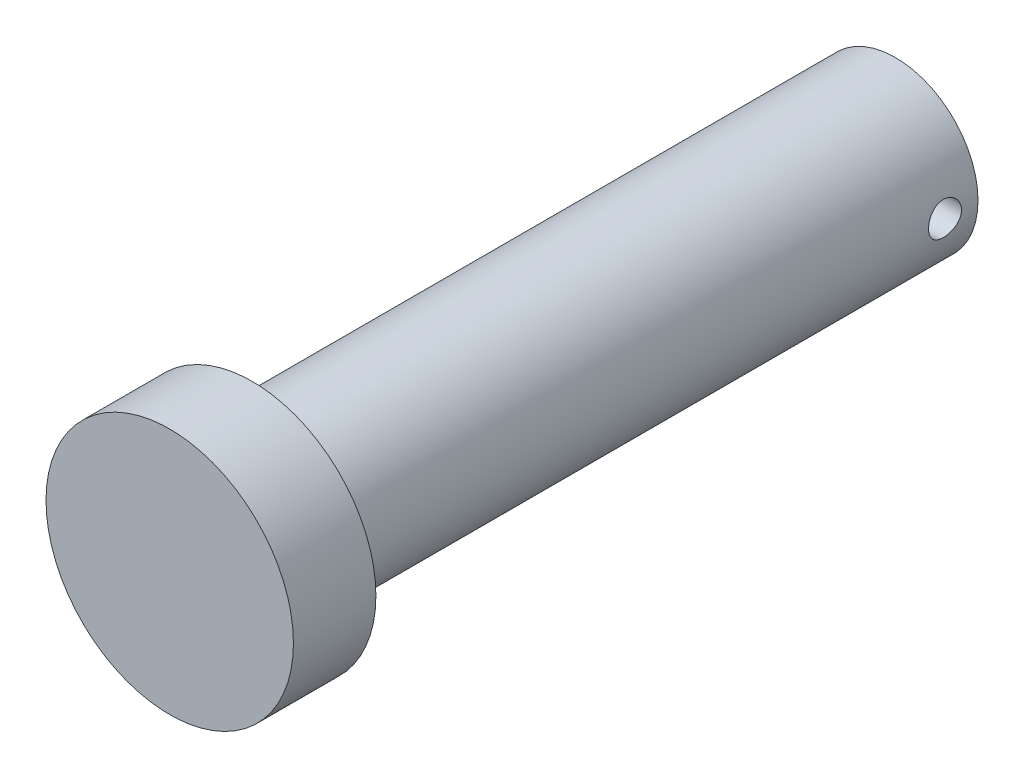
ISO-10303-21;
HEADER;
FILE_DESCRIPTION(('STEP AP214'),'2;1');
FILE_NAME('part.step','',(''),(''),'','','');
FILE_SCHEMA(('AUTOMOTIVE_DESIGN { 1 0 10303 214 1 1 1 1 }'));
ENDSEC;
DATA;
#1=APPLICATION_CONTEXT('core data for automotive mechanical design processes');
#2=APPLICATION_PROTOCOL_DEFINITION('international standard','automotive_design',2000,#1);
#3=PRODUCT_CONTEXT('',#1,'mechanical');
#4=PRODUCT('Part','Part','',(#3));
#5=PRODUCT_RELATED_PRODUCT_CATEGORY('part','',(#4));
#6=PRODUCT_DEFINITION_FORMATION('','',#4);
#7=PRODUCT_DEFINITION_CONTEXT('part definition',#1,'design');
#8=PRODUCT_DEFINITION('design','',#6,#7);
#9=PRODUCT_DEFINITION_SHAPE('','',#8);
#10=(LENGTH_UNIT() NAMED_UNIT(*) SI_UNIT(.MILLI.,.METRE.));
#11=(NAMED_UNIT(*) PLANE_ANGLE_UNIT() SI_UNIT($,.RADIAN.));
#12=(NAMED_UNIT(*) SI_UNIT($,.STERADIAN.) SOLID_ANGLE_UNIT());
#13=UNCERTAINTY_MEASURE_WITH_UNIT(LENGTH_MEASURE(1.E-05),#10,'distance_accuracy_value','');
#14=(GEOMETRIC_REPRESENTATION_CONTEXT(3) GLOBAL_UNCERTAINTY_ASSIGNED_CONTEXT((#13)) GLOBAL_UNIT_ASSIGNED_CONTEXT((#10,
#11,#12)) REPRESENTATION_CONTEXT('',''));
#15=CARTESIAN_POINT('',(0.,0.,0.));
#16=DIRECTION('',(0.,0.,1.));
#17=DIRECTION('',(1.,0.,0.));
#18=AXIS2_PLACEMENT_3D('',#15,#16,#17);
#19=CARTESIAN_POINT('',(0.,0.,44.));
#20=DIRECTION('',(0.,0.,-1.));
#21=DIRECTION('',(-1.,0.,0.));
#22=AXIS2_PLACEMENT_3D('',#19,#20,#21);
#23=CYLINDRICAL_SURFACE('',#22,5.);
#24=CARTESIAN_POINT('',(0.,0.,0.));
#25=DIRECTION('',(0.,0.,1.));
#26=DIRECTION('',(1.,0.,0.));
#27=AXIS2_PLACEMENT_3D('',#24,#25,#26);
#28=CIRCLE('',#27,5.);
#29=CARTESIAN_POINT('',(5.,0.,0.));
#30=VERTEX_POINT('',#29);
#31=EDGE_CURVE('E58',#30,#30,#28,.T.);
#32=ORIENTED_EDGE('',*,*,#31,.T.);
#33=EDGE_LOOP('',(#32));
#34=FACE_BOUND('',#33,.T.);
#35=CARTESIAN_POINT('',(0.,0.,39.));
#36=DIRECTION('',(0.,0.,1.));
#37=DIRECTION('',(1.,0.,0.));
#38=AXIS2_PLACEMENT_3D('',#35,#36,#37);
#39=CIRCLE('',#38,5.);
#40=CARTESIAN_POINT('',(5.,0.,39.));
#41=VERTEX_POINT('',#40);
#42=EDGE_CURVE('E53',#41,#41,#39,.T.);
#43=ORIENTED_EDGE('',*,*,#42,.F.);
#44=EDGE_LOOP('',(#43));
#45=FACE_BOUND('',#44,.T.);
#46=CARTESIAN_POINT('',(-5.,0.,3.));
#47=CARTESIAN_POINT('',(-4.99999897580871,0.0555769067926332,2.99999795550165));
#48=CARTESIAN_POINT('',(-4.99906385178231,0.111179660201522,2.99535115703235));
#49=CARTESIAN_POINT('',(-4.99542365623231,0.220813507689019,2.97690149988475));
#50=CARTESIAN_POINT('',(-4.99271717860186,0.274843317541356,2.96309136719849));
#51=CARTESIAN_POINT('',(-4.98583649278287,0.379730305263313,2.92675872637921));
#52=CARTESIAN_POINT('',(-4.98166369076718,0.430590467933134,2.90424456315531));
#53=CARTESIAN_POINT('',(-4.97230398035314,0.527807988864226,2.85116775248871));
#54=CARTESIAN_POINT('',(-4.96711713235707,0.574165615075812,2.8206055843928));
#55=CARTESIAN_POINT('',(-4.9562216532997,0.661693477314865,2.75186150570857));
#56=CARTESIAN_POINT('',(-4.95050745504347,0.702793951158524,2.7135916446088));
#57=CARTESIAN_POINT('',(-4.93924180452588,0.778036756608028,2.6307075836083));
#58=CARTESIAN_POINT('',(-4.93369036500424,0.812178544770425,2.58609288866488));
#59=CARTESIAN_POINT('',(-4.92332441812615,0.87283175334762,2.49128380698812));
#60=CARTESIAN_POINT('',(-4.91851707364946,0.899270938865867,2.44104235620364));
#61=CARTESIAN_POINT('',(-4.91026268058418,0.943305666580308,2.33671818099592));
#62=CARTESIAN_POINT('',(-4.90681549761962,0.960902082437238,2.28263583665366));
#63=CARTESIAN_POINT('',(-4.90172805252204,0.986525299884827,2.17291563609208));
#64=CARTESIAN_POINT('',(-4.90006470107188,0.994674497958777,2.11730745585777));
#65=CARTESIAN_POINT('',(-4.89866375060627,1.00155212772612,2.00549017863566));
#66=CARTESIAN_POINT('',(-4.89892595467841,1.0002815227135,1.94928114367985));
#67=CARTESIAN_POINT('',(-4.90132551148185,0.988454573101819,1.838753211979));
#68=CARTESIAN_POINT('',(-4.90343452858763,0.978038540243905,1.78441859437269));
#69=CARTESIAN_POINT('',(-4.90924546160001,0.94843788462305,1.678283923337));
#70=CARTESIAN_POINT('',(-4.91294745357779,0.929252843100681,1.62648399108099));
#71=CARTESIAN_POINT('',(-4.92155618500408,0.88252478367472,1.5264847382964));
#72=CARTESIAN_POINT('',(-4.92647089813704,0.854926151232114,1.47831212043083));
#73=CARTESIAN_POINT('',(-4.93694618773062,0.792193574572679,1.38722915002719));
#74=CARTESIAN_POINT('',(-4.94250683838366,0.757058764356828,1.34431940314884));
#75=CARTESIAN_POINT('',(-4.95377021241462,0.679499934560584,1.26417059754306));
#76=CARTESIAN_POINT('',(-4.95947369210905,0.636956161212444,1.22704743214087));
#77=CARTESIAN_POINT('',(-4.97028848714408,0.546185024062009,1.16044615369878));
#78=CARTESIAN_POINT('',(-4.97539979488974,0.497957587379389,1.13096813870642));
#79=CARTESIAN_POINT('',(-4.98446690160887,0.39705938687892,1.08047249077402));
#80=CARTESIAN_POINT('',(-4.98842088848272,0.344381819585299,1.05946810635546));
#81=CARTESIAN_POINT('',(-4.99471408987858,0.236148976448664,1.02663952596143));
#82=CARTESIAN_POINT('',(-4.99705350000531,0.180594050072449,1.01481421792637));
#83=CARTESIAN_POINT('',(-4.99982671866868,0.0691794056271499,1.00084354620572));
#84=CARTESIAN_POINT('',(-5.0002917465247,0.0133403283255757,0.998539580459731));
#85=CARTESIAN_POINT('',(-4.99935051930103,-0.0979249341927146,1.00324985894218));
#86=CARTESIAN_POINT('',(-4.99794436941446,-0.153351142443794,1.0102635793526));
#87=CARTESIAN_POINT('',(-4.99343832008018,-0.261705659946542,1.03327837354396));
#88=CARTESIAN_POINT('',(-4.99035376404206,-0.314651948339904,1.0491980684979));
#89=CARTESIAN_POINT('',(-4.98283552061033,-0.417123627499668,1.08948398265581));
#90=CARTESIAN_POINT('',(-4.97840173214227,-0.46664876163754,1.11385083467683));
#91=CARTESIAN_POINT('',(-4.96859911533294,-0.561541173686218,1.17068249065131));
#92=CARTESIAN_POINT('',(-4.96321950437052,-0.606850126752189,1.20324278103895));
#93=CARTESIAN_POINT('',(-4.95214734829882,-0.691418019119207,1.27540919120728));
#94=CARTESIAN_POINT('',(-4.94645476968388,-0.730676308930763,1.31501606639987));
#95=CARTESIAN_POINT('',(-4.93529303556965,-0.802640590774177,1.40087335189112));
#96=CARTESIAN_POINT('',(-4.92982860233304,-0.835237702448656,1.44721574422134));
#97=CARTESIAN_POINT('',(-4.91984191796194,-0.892185420051206,1.54481136135668));
#98=CARTESIAN_POINT('',(-4.91531962913342,-0.916536355922903,1.59606438957355));
#99=CARTESIAN_POINT('',(-4.90776740584383,-0.956151841581961,1.70176824614955));
#100=CARTESIAN_POINT('',(-4.90472974872187,-0.971463499791051,1.75620084121032));
#101=CARTESIAN_POINT('',(-4.90047436792025,-0.992708651627197,1.86693345349091));
#102=CARTESIAN_POINT('',(-4.89925640691111,-0.998643368225113,1.92323322620935));
#103=CARTESIAN_POINT('',(-4.89879149631379,-1.00092091086747,2.03500886454432));
#104=CARTESIAN_POINT('',(-4.89950919189301,-0.997435788070896,2.09048114892701));
#105=CARTESIAN_POINT('',(-4.90275573484614,-0.981352304100061,2.20003164990503));
#106=CARTESIAN_POINT('',(-4.90528456767169,-0.968754016129299,2.2541098776948));
#107=CARTESIAN_POINT('',(-4.91185264219158,-0.934878568498954,2.35922771124055));
#108=CARTESIAN_POINT('',(-4.9158882101883,-0.913622506717345,2.41027436050242));
#109=CARTESIAN_POINT('',(-4.9250171497417,-0.863054644601604,2.50810372073444));
#110=CARTESIAN_POINT('',(-4.93011060998894,-0.833742168774882,2.55488607372514));
#111=CARTESIAN_POINT('',(-4.94088960523225,-0.767305914786414,2.64371557215031));
#112=CARTESIAN_POINT('',(-4.94658372909699,-0.730057887235181,2.6856687652676));
#113=CARTESIAN_POINT('',(-4.95786081871955,-0.649064369013141,2.76278620552917));
#114=CARTESIAN_POINT('',(-4.96344375863184,-0.605317387153335,2.79794889031727));
#115=CARTESIAN_POINT('',(-4.97393832387971,-0.512017629088246,2.86083464394645));
#116=CARTESIAN_POINT('',(-4.97884231219246,-0.462408884429835,2.88847600328003));
#117=CARTESIAN_POINT('',(-4.98735125085,-0.359166360940732,2.93498612259659));
#118=CARTESIAN_POINT('',(-4.99095737138616,-0.305536260863126,2.95386278953249));
#119=CARTESIAN_POINT('',(-4.99576372595371,-0.209821488923779,2.97865194804472));
#120=CARTESIAN_POINT('',(-4.99734303158452,-0.168281664013784,2.98664319370776));
#121=CARTESIAN_POINT('',(-4.99946154139893,-0.084499525210067,2.99731791235836));
#122=CARTESIAN_POINT('',(-5.00000077873155,-0.042257233748619,3.00000155450977));
#123=CARTESIAN_POINT('',(-5.,0.,3.));
#124=B_SPLINE_CURVE_WITH_KNOTS('',3,(#46,#47,#48,#49,#50,#51,#52,#53,#54,#55,#56,#57,#58,#59,
#60,#61,#62,#63,#64,#65,#66,#67,#68,#69,#70,#71,#72,#73,#74,#75,#76,#77,#78,#79,#80,#81,#82,#83,
#84,#85,#86,#87,#88,#89,#90,#91,#92,#93,#94,#95,#96,#97,#98,#99,#100,#101,#102,#103,#104,#105,
#106,#107,#108,#109,#110,#111,#112,#113,#114,#115,#116,#117,#118,#119,#120,#121,#122,#123),
.UNSPECIFIED.,.T.,.F.,(4,2,2,2,2,2,2,2,2,2,2,2,2,2,2,2,2,2,2,2,2,2,2,2,2,2,2,2,2,2,2,2,2,2,2,2,
2,2,4),(0.,0.166576130661259,0.333284650691323,0.499833735250342,0.666372902230863,
0.834932670112186,1.00350559674737,1.17361195005923,1.34370149365198,1.51156185103587,
1.67940504281225,1.84471727006278,2.0100373925373,2.17647490203593,2.3429315474967,
2.51238252491351,2.6818356753982,2.85155274854024,3.02124925698036,3.18810735676265,
3.35495607657868,3.52030453950723,3.68566539216022,3.85305066033359,4.0204538834593,
4.19040628579226,4.36035188723466,4.52940381032723,4.69843368330415,4.86439722567701,
5.03035943492608,5.1959196125311,5.36149367581866,5.52988076239143,5.6983065453293,
5.86849496675637,6.03852955517518,6.16518775289894,6.29184191370996),.UNSPECIFIED.);
#125=CARTESIAN_POINT('',(-5.,0.,3.));
#126=VERTEX_POINT('',#125);
#127=EDGE_CURVE('E48',#126,#126,#124,.T.);
#128=ORIENTED_EDGE('',*,*,#127,.F.);
#129=EDGE_LOOP('',(#128));
#130=FACE_BOUND('',#129,.T.);
#131=CARTESIAN_POINT('',(5.,0.,3.));
#132=CARTESIAN_POINT('',(4.99999897580871,-0.0555769067926335,2.99999795550165));
#133=CARTESIAN_POINT('',(4.99906385178231,-0.111179660201523,2.99535115703235));
#134=CARTESIAN_POINT('',(4.99542365623231,-0.22081350768902,2.97690149988475));
#135=CARTESIAN_POINT('',(4.99271717860186,-0.274843317541356,2.96309136719849));
#136=CARTESIAN_POINT('',(4.98583649278287,-0.379730305263313,2.92675872637921));
#137=CARTESIAN_POINT('',(4.98166369076718,-0.430590467933135,2.90424456315531));
#138=CARTESIAN_POINT('',(4.97230398035314,-0.527807988864226,2.85116775248871));
#139=CARTESIAN_POINT('',(4.96711713235707,-0.574165615075813,2.8206055843928));
#140=CARTESIAN_POINT('',(4.9562216532997,-0.661693477314866,2.75186150570857));
#141=CARTESIAN_POINT('',(4.95050745504347,-0.702793951158525,2.7135916446088));
#142=CARTESIAN_POINT('',(4.93924180452588,-0.778036756608029,2.6307075836083));
#143=CARTESIAN_POINT('',(4.93369036500424,-0.812178544770425,2.58609288866488));
#144=CARTESIAN_POINT('',(4.92332441812615,-0.872831753347621,2.49128380698812));
#145=CARTESIAN_POINT('',(4.91851707364946,-0.899270938865867,2.44104235620364));
#146=CARTESIAN_POINT('',(4.91026268058418,-0.943305666580308,2.33671818099592));
#147=CARTESIAN_POINT('',(4.90681549761962,-0.960902082437238,2.28263583665366));
#148=CARTESIAN_POINT('',(4.90172805252204,-0.986525299884828,2.17291563609208));
#149=CARTESIAN_POINT('',(4.90006470107188,-0.994674497958778,2.11730745585777));
#150=CARTESIAN_POINT('',(4.89866375060627,-1.00155212772612,2.00549017863566));
#151=CARTESIAN_POINT('',(4.89892595467841,-1.0002815227135,1.94928114367985));
#152=CARTESIAN_POINT('',(4.90132551148185,-0.988454573101819,1.838753211979));
#153=CARTESIAN_POINT('',(4.90343452858763,-0.978038540243906,1.78441859437269));
#154=CARTESIAN_POINT('',(4.90924546160001,-0.948437884623051,1.678283923337));
#155=CARTESIAN_POINT('',(4.91294745357779,-0.929252843100681,1.62648399108099));
#156=CARTESIAN_POINT('',(4.92155618500408,-0.88252478367472,1.5264847382964));
#157=CARTESIAN_POINT('',(4.92647089813704,-0.854926151232114,1.47831212043083));
#158=CARTESIAN_POINT('',(4.93694618773062,-0.792193574572679,1.38722915002719));
#159=CARTESIAN_POINT('',(4.94250683838366,-0.757058764356829,1.34431940314884));
#160=CARTESIAN_POINT('',(4.95377021241462,-0.679499934560584,1.26417059754306));
#161=CARTESIAN_POINT('',(4.95947369210905,-0.636956161212445,1.22704743214087));
#162=CARTESIAN_POINT('',(4.97028848714408,-0.54618502406201,1.16044615369878));
#163=CARTESIAN_POINT('',(4.97539979488974,-0.49795758737939,1.13096813870642));
#164=CARTESIAN_POINT('',(4.98446690160887,-0.397059386878921,1.08047249077402));
#165=CARTESIAN_POINT('',(4.98842088848272,-0.3443818195853,1.05946810635546));
#166=CARTESIAN_POINT('',(4.99471408987858,-0.236148976448665,1.02663952596143));
#167=CARTESIAN_POINT('',(4.99705350000531,-0.180594050072449,1.01481421792637));
#168=CARTESIAN_POINT('',(4.99982671866868,-0.0691794056271503,1.00084354620572));
#169=CARTESIAN_POINT('',(5.0002917465247,-0.0133403283255761,0.998539580459731));
#170=CARTESIAN_POINT('',(4.99935051930103,0.0979249341927141,1.00324985894218));
#171=CARTESIAN_POINT('',(4.99794436941446,0.153351142443793,1.0102635793526));
#172=CARTESIAN_POINT('',(4.99343832008018,0.261705659946541,1.03327837354396));
#173=CARTESIAN_POINT('',(4.99035376404206,0.314651948339903,1.0491980684979));
#174=CARTESIAN_POINT('',(4.98283552061033,0.417123627499667,1.08948398265581));
#175=CARTESIAN_POINT('',(4.97840173214227,0.466648761637539,1.11385083467683));
#176=CARTESIAN_POINT('',(4.96859911533294,0.561541173686218,1.17068249065131));
#177=CARTESIAN_POINT('',(4.96321950437052,0.606850126752188,1.20324278103895));
#178=CARTESIAN_POINT('',(4.95214734829882,0.691418019119207,1.27540919120728));
#179=CARTESIAN_POINT('',(4.94645476968388,0.730676308930763,1.31501606639987));
#180=CARTESIAN_POINT('',(4.93529303556965,0.802640590774176,1.40087335189112));
#181=CARTESIAN_POINT('',(4.92982860233304,0.835237702448655,1.44721574422134));
#182=CARTESIAN_POINT('',(4.91984191796194,0.892185420051206,1.54481136135668));
#183=CARTESIAN_POINT('',(4.91531962913342,0.916536355922903,1.59606438957355));
#184=CARTESIAN_POINT('',(4.90776740584383,0.95615184158196,1.70176824614955));
#185=CARTESIAN_POINT('',(4.90472974872187,0.971463499791051,1.75620084121032));
#186=CARTESIAN_POINT('',(4.90047436792025,0.992708651627196,1.86693345349091));
#187=CARTESIAN_POINT('',(4.89925640691111,0.998643368225112,1.92323322620935));
#188=CARTESIAN_POINT('',(4.89879149631379,1.00092091086747,2.03500886454432));
#189=CARTESIAN_POINT('',(4.89950919189301,0.997435788070896,2.09048114892701));
#190=CARTESIAN_POINT('',(4.90275573484614,0.981352304100061,2.20003164990503));
#191=CARTESIAN_POINT('',(4.90528456767169,0.968754016129298,2.2541098776948));
#192=CARTESIAN_POINT('',(4.91185264219159,0.934878568498954,2.35922771124055));
#193=CARTESIAN_POINT('',(4.91588821018831,0.913622506717344,2.41027436050242));
#194=CARTESIAN_POINT('',(4.9250171497417,0.863054644601604,2.50810372073444));
#195=CARTESIAN_POINT('',(4.93011060998894,0.833742168774882,2.55488607372514));
#196=CARTESIAN_POINT('',(4.94088960523225,0.767305914786414,2.64371557215031));
#197=CARTESIAN_POINT('',(4.94658372909699,0.73005788723518,2.6856687652676));
#198=CARTESIAN_POINT('',(4.95786081871955,0.64906436901314,2.76278620552917));
#199=CARTESIAN_POINT('',(4.96344375863184,0.605317387153334,2.79794889031727));
#200=CARTESIAN_POINT('',(4.97393832387971,0.512017629088246,2.86083464394645));
#201=CARTESIAN_POINT('',(4.97884231219246,0.462408884429834,2.88847600328003));
#202=CARTESIAN_POINT('',(4.98735125085,0.359166360940732,2.93498612259659));
#203=CARTESIAN_POINT('',(4.99095737138616,0.305536260863125,2.95386278953249));
#204=CARTESIAN_POINT('',(4.99576372595371,0.209821488923779,2.97865194804472));
#205=CARTESIAN_POINT('',(4.99734303158452,0.168281664013784,2.98664319370776));
#206=CARTESIAN_POINT('',(4.99946154139893,0.0844995252100666,2.99731791235836));
#207=CARTESIAN_POINT('',(5.00000077873155,0.0422572337486187,3.00000155450977));
#208=CARTESIAN_POINT('',(5.,0.,3.));
#209=B_SPLINE_CURVE_WITH_KNOTS('',3,(#131,#132,#133,#134,#135,#136,#137,#138,#139,#140,#141,
#142,#143,#144,#145,#146,#147,#148,#149,#150,#151,#152,#153,#154,#155,#156,#157,#158,#159,#160,
#161,#162,#163,#164,#165,#166,#167,#168,#169,#170,#171,#172,#173,#174,#175,#176,#177,#178,#179,
#180,#181,#182,#183,#184,#185,#186,#187,#188,#189,#190,#191,#192,#193,#194,#195,#196,#197,#198,
#199,#200,#201,#202,#203,#204,#205,#206,#207,#208),.UNSPECIFIED.,.T.,.F.,(4,2,2,2,2,2,2,2,2,2,2,
2,2,2,2,2,2,2,2,2,2,2,2,2,2,2,2,2,2,2,2,2,2,2,2,2,2,2,4),(0.,0.166576130661259,
0.333284650691323,0.499833735250342,0.666372902230864,0.834932670112186,1.00350559674737,
1.17361195005923,1.34370149365198,1.51156185103587,1.67940504281225,1.84471727006278,
2.0100373925373,2.17647490203593,2.3429315474967,2.51238252491351,2.6818356753982,
2.85155274854024,3.02124925698036,3.18810735676265,3.35495607657868,3.52030453950723,
3.68566539216022,3.85305066033359,4.0204538834593,4.19040628579226,4.36035188723467,
4.52940381032723,4.69843368330415,4.86439722567702,5.03035943492608,5.1959196125311,
5.36149367581867,5.52988076239143,5.6983065453293,5.86849496675637,6.03852955517519,
6.16518775289894,6.29184191370996),.UNSPECIFIED.);
#210=CARTESIAN_POINT('',(5.,0.,3.));
#211=VERTEX_POINT('',#210);
#212=EDGE_CURVE('E10',#211,#211,#209,.T.);
#213=ORIENTED_EDGE('',*,*,#212,.F.);
#214=EDGE_LOOP('',(#213));
#215=FACE_BOUND('',#214,.T.);
#216=ADVANCED_FACE('F36',(#34,#45,#130,#215),#23,.T.);
#217=CARTESIAN_POINT('',(0.,0.,0.));
#218=DIRECTION('',(0.,0.,1.));
#219=DIRECTION('',(1.,0.,0.));
#220=AXIS2_PLACEMENT_3D('',#217,#218,#219);
#221=PLANE('',#220);
#222=ORIENTED_EDGE('',*,*,#31,.F.);
#223=EDGE_LOOP('',(#222));
#224=FACE_BOUND('',#223,.T.);
#225=ADVANCED_FACE('F77',(#224),#221,.F.);
#226=CARTESIAN_POINT('',(0.,0.,39.));
#227=DIRECTION('',(0.,0.,1.));
#228=DIRECTION('',(1.,0.,0.));
#229=AXIS2_PLACEMENT_3D('',#226,#227,#228);
#230=CYLINDRICAL_SURFACE('',#229,7.5);
#231=CARTESIAN_POINT('',(0.,0.,39.));
#232=DIRECTION('',(0.,0.,1.));
#233=DIRECTION('',(1.,0.,0.));
#234=AXIS2_PLACEMENT_3D('',#231,#232,#233);
#235=CIRCLE('',#234,7.5);
#236=CARTESIAN_POINT('',(7.5,0.,39.));
#237=VERTEX_POINT('',#236);
#238=EDGE_CURVE('E90',#237,#237,#235,.T.);
#239=ORIENTED_EDGE('',*,*,#238,.T.);
#240=EDGE_LOOP('',(#239));
#241=FACE_BOUND('',#240,.T.);
#242=CARTESIAN_POINT('',(0.,0.,44.));
#243=DIRECTION('',(0.,0.,1.));
#244=DIRECTION('',(1.,0.,0.));
#245=AXIS2_PLACEMENT_3D('',#242,#243,#244);
#246=CIRCLE('',#245,7.5);
#247=CARTESIAN_POINT('',(7.5,0.,44.));
#248=VERTEX_POINT('',#247);
#249=EDGE_CURVE('E93',#248,#248,#246,.T.);
#250=ORIENTED_EDGE('',*,*,#249,.F.);
#251=EDGE_LOOP('',(#250));
#252=FACE_BOUND('',#251,.T.);
#253=ADVANCED_FACE('F73',(#241,#252),#230,.T.);
#254=CARTESIAN_POINT('',(0.,0.,39.));
#255=DIRECTION('',(0.,0.,1.));
#256=DIRECTION('',(1.,0.,0.));
#257=AXIS2_PLACEMENT_3D('',#254,#255,#256);
#258=PLANE('',#257);
#259=ORIENTED_EDGE('',*,*,#42,.T.);
#260=EDGE_LOOP('',(#259));
#261=FACE_BOUND('',#260,.T.);
#262=ORIENTED_EDGE('',*,*,#238,.F.);
#263=EDGE_LOOP('',(#262));
#264=FACE_BOUND('',#263,.T.);
#265=ADVANCED_FACE('F69',(#261,#264),#258,.F.);
#266=CARTESIAN_POINT('',(0.,0.,44.));
#267=DIRECTION('',(0.,0.,1.));
#268=DIRECTION('',(1.,0.,0.));
#269=AXIS2_PLACEMENT_3D('',#266,#267,#268);
#270=PLANE('',#269);
#271=ORIENTED_EDGE('',*,*,#249,.T.);
#272=EDGE_LOOP('',(#271));
#273=FACE_BOUND('',#272,.T.);
#274=ADVANCED_FACE('F68',(#273),#270,.T.);
#275=CARTESIAN_POINT('',(5.,0.,2.));
#276=DIRECTION('',(-1.,0.,0.));
#277=DIRECTION('',(0.,0.,1.));
#278=AXIS2_PLACEMENT_3D('',#275,#276,#277);
#279=CYLINDRICAL_SURFACE('',#278,1.);
#280=ORIENTED_EDGE('',*,*,#127,.T.);
#281=EDGE_LOOP('',(#280));
#282=FACE_BOUND('',#281,.T.);
#283=ORIENTED_EDGE('',*,*,#212,.T.);
#284=EDGE_LOOP('',(#283));
#285=FACE_BOUND('',#284,.T.);
#286=ADVANCED_FACE('F64',(#282,#285),#279,.F.);
#287=CLOSED_SHELL('',(#216,#225,#253,#265,#274,#286));
#288=MANIFOLD_SOLID_BREP('B2',#287);
#289=ADVANCED_BREP_SHAPE_REPRESENTATION('',(#18,#288),#14);
#290=SHAPE_DEFINITION_REPRESENTATION(#9,#289);
ENDSEC;
END-ISO-10303-21;
